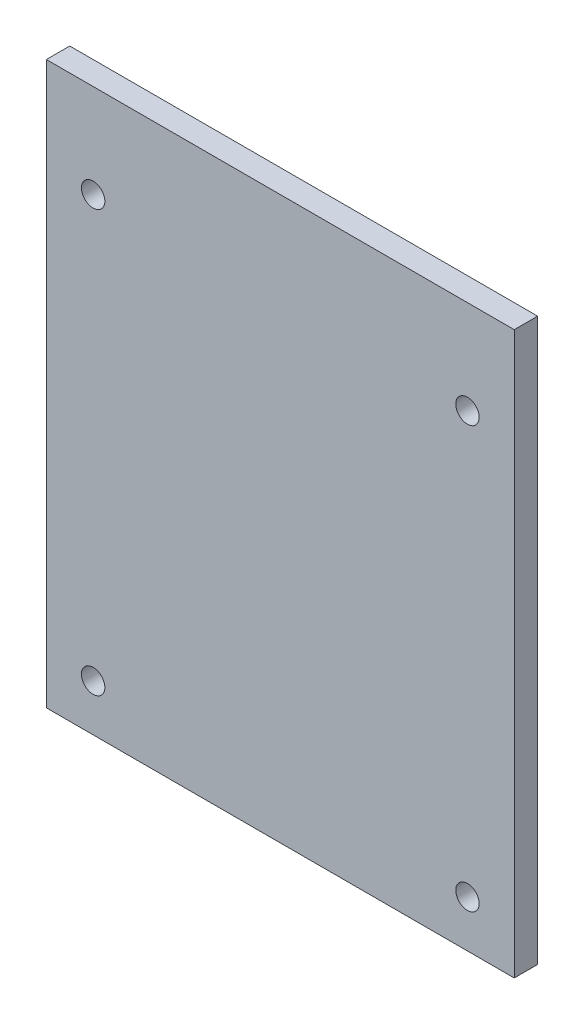
ISO-10303-21;
HEADER;
FILE_DESCRIPTION(('STEP AP214'),'2;1');
FILE_NAME('part.step','',(''),(''),'','','');
FILE_SCHEMA(('AUTOMOTIVE_DESIGN { 1 0 10303 214 1 1 1 1 }'));
ENDSEC;
DATA;
#1=APPLICATION_CONTEXT('core data for automotive mechanical design processes');
#2=APPLICATION_PROTOCOL_DEFINITION('international standard','automotive_design',2000,#1);
#3=PRODUCT_CONTEXT('',#1,'mechanical');
#4=PRODUCT('Part','Part','',(#3));
#5=PRODUCT_RELATED_PRODUCT_CATEGORY('part','',(#4));
#6=PRODUCT_DEFINITION_FORMATION('','',#4);
#7=PRODUCT_DEFINITION_CONTEXT('part definition',#1,'design');
#8=PRODUCT_DEFINITION('design','',#6,#7);
#9=PRODUCT_DEFINITION_SHAPE('','',#8);
#10=(LENGTH_UNIT() NAMED_UNIT(*) SI_UNIT(.MILLI.,.METRE.));
#11=(NAMED_UNIT(*) PLANE_ANGLE_UNIT() SI_UNIT($,.RADIAN.));
#12=(NAMED_UNIT(*) SI_UNIT($,.STERADIAN.) SOLID_ANGLE_UNIT());
#13=UNCERTAINTY_MEASURE_WITH_UNIT(LENGTH_MEASURE(1.E-05),#10,'distance_accuracy_value','');
#14=(GEOMETRIC_REPRESENTATION_CONTEXT(3) GLOBAL_UNCERTAINTY_ASSIGNED_CONTEXT((#13)) GLOBAL_UNIT_ASSIGNED_CONTEXT((#10,
#11,#12)) REPRESENTATION_CONTEXT('',''));
#15=CARTESIAN_POINT('',(0.,0.,0.));
#16=DIRECTION('',(0.,0.,1.));
#17=DIRECTION('',(1.,0.,0.));
#18=AXIS2_PLACEMENT_3D('',#15,#16,#17);
#19=CARTESIAN_POINT('',(-25.,25.,0.));
#20=DIRECTION('',(0.,0.,1.));
#21=DIRECTION('',(1.,0.,0.));
#22=AXIS2_PLACEMENT_3D('',#19,#20,#21);
#23=PLANE('',#22);
#24=DIRECTION('',(0.,1.,0.));
#25=VECTOR('',#24,1.);
#26=CARTESIAN_POINT('',(-50.,-75.,0.));
#27=LINE('',#26,#25);
#28=CARTESIAN_POINT('',(-50.,-25.0000000000007,0.));
#29=VERTEX_POINT('',#28);
#30=CARTESIAN_POINT('',(-50.,95.,0.));
#31=VERTEX_POINT('',#30);
#32=EDGE_CURVE('E91',#29,#31,#27,.T.);
#33=ORIENTED_EDGE('',*,*,#32,.F.);
#34=DIRECTION('',(1.,0.,0.));
#35=VECTOR('',#34,1.);
#36=CARTESIAN_POINT('',(0.,-25.0000000000007,0.));
#37=LINE('',#36,#35);
#38=CARTESIAN_POINT('',(50.,-25.0000000000007,0.));
#39=VERTEX_POINT('',#38);
#40=EDGE_CURVE('E76',#29,#39,#37,.T.);
#41=ORIENTED_EDGE('',*,*,#40,.T.);
#42=DIRECTION('',(0.,-1.,0.));
#43=VECTOR('',#42,1.);
#44=CARTESIAN_POINT('',(50.,-75.,0.));
#45=LINE('',#44,#43);
#46=CARTESIAN_POINT('',(50.,95.,0.));
#47=VERTEX_POINT('',#46);
#48=EDGE_CURVE('E38',#47,#39,#45,.T.);
#49=ORIENTED_EDGE('',*,*,#48,.F.);
#50=DIRECTION('',(1.,0.,0.));
#51=VECTOR('',#50,1.);
#52=CARTESIAN_POINT('',(-50.,95.,0.));
#53=LINE('',#52,#51);
#54=EDGE_CURVE('E56',#31,#47,#53,.T.);
#55=ORIENTED_EDGE('',*,*,#54,.F.);
#56=EDGE_LOOP('',(#33,#41,#49,#55));
#57=FACE_BOUND('',#56,.T.);
#58=CARTESIAN_POINT('',(-40.,75.,0.));
#59=DIRECTION('',(0.,0.,1.));
#60=DIRECTION('',(1.,0.,0.));
#61=AXIS2_PLACEMENT_3D('',#58,#59,#60);
#62=CIRCLE('',#61,2.49999999999986);
#63=CARTESIAN_POINT('',(-37.5000000000001,75.,0.));
#64=VERTEX_POINT('',#63);
#65=EDGE_CURVE('E107',#64,#64,#62,.T.);
#66=ORIENTED_EDGE('',*,*,#65,.F.);
#67=EDGE_LOOP('',(#66));
#68=FACE_BOUND('',#67,.T.);
#69=CARTESIAN_POINT('',(-40.,-15.,0.));
#70=DIRECTION('',(0.,0.,1.));
#71=DIRECTION('',(1.,0.,0.));
#72=AXIS2_PLACEMENT_3D('',#69,#70,#71);
#73=CIRCLE('',#72,2.49999999999986);
#74=CARTESIAN_POINT('',(-37.5000000000001,-15.,0.));
#75=VERTEX_POINT('',#74);
#76=EDGE_CURVE('E102',#75,#75,#73,.T.);
#77=ORIENTED_EDGE('',*,*,#76,.F.);
#78=EDGE_LOOP('',(#77));
#79=FACE_BOUND('',#78,.T.);
#80=CARTESIAN_POINT('',(40.,75.,0.));
#81=DIRECTION('',(0.,0.,1.));
#82=DIRECTION('',(1.,0.,0.));
#83=AXIS2_PLACEMENT_3D('',#80,#81,#82);
#84=CIRCLE('',#83,2.49999999999986);
#85=CARTESIAN_POINT('',(42.4999999999999,75.,0.));
#86=VERTEX_POINT('',#85);
#87=EDGE_CURVE('E119',#86,#86,#84,.T.);
#88=ORIENTED_EDGE('',*,*,#87,.F.);
#89=EDGE_LOOP('',(#88));
#90=FACE_BOUND('',#89,.T.);
#91=CARTESIAN_POINT('',(40.,-15.,0.));
#92=DIRECTION('',(0.,0.,1.));
#93=DIRECTION('',(1.,0.,0.));
#94=AXIS2_PLACEMENT_3D('',#91,#92,#93);
#95=CIRCLE('',#94,2.49999999999986);
#96=CARTESIAN_POINT('',(42.4999999999999,-15.,0.));
#97=VERTEX_POINT('',#96);
#98=EDGE_CURVE('E113',#97,#97,#95,.T.);
#99=ORIENTED_EDGE('',*,*,#98,.F.);
#100=EDGE_LOOP('',(#99));
#101=FACE_BOUND('',#100,.T.);
#102=ADVANCED_FACE('F34',(#57,#68,#79,#90,#101),#23,.T.);
#103=CARTESIAN_POINT('',(-25.,-25.,2100.));
#104=DIRECTION('',(0.,1.,0.));
#105=DIRECTION('',(0.,0.,1.));
#106=AXIS2_PLACEMENT_3D('',#103,#104,#105);
#107=PLANE('',#106);
#108=ORIENTED_EDGE('',*,*,#40,.F.);
#109=DIRECTION('',(0.,0.,-1.));
#110=VECTOR('',#109,1.);
#111=CARTESIAN_POINT('',(-50.,-25.0000000000007,-5.));
#112=LINE('',#111,#110);
#113=CARTESIAN_POINT('',(-50.,-25.0000000000007,-5.));
#114=VERTEX_POINT('',#113);
#115=EDGE_CURVE('E78',#29,#114,#112,.T.);
#116=ORIENTED_EDGE('',*,*,#115,.T.);
#117=DIRECTION('',(1.,0.,0.));
#118=VECTOR('',#117,1.);
#119=CARTESIAN_POINT('',(-5200.,-25.0000000000007,-4.99999999999989));
#120=LINE('',#119,#118);
#121=CARTESIAN_POINT('',(49.9999999999998,-25.0000000000007,-4.99999999999989));
#122=VERTEX_POINT('',#121);
#123=EDGE_CURVE('E94',#114,#122,#120,.T.);
#124=ORIENTED_EDGE('',*,*,#123,.T.);
#125=DIRECTION('',(0.,0.,1.));
#126=VECTOR('',#125,1.);
#127=CARTESIAN_POINT('',(50.,-25.0000000000007,-5.));
#128=LINE('',#127,#126);
#129=EDGE_CURVE('E81',#122,#39,#128,.T.);
#130=ORIENTED_EDGE('',*,*,#129,.T.);
#131=EDGE_LOOP('',(#108,#116,#124,#130));
#132=FACE_BOUND('',#131,.T.);
#133=ADVANCED_FACE('F36',(#132),#107,.F.);
#134=CARTESIAN_POINT('',(-40.,-15.,-5.));
#135=DIRECTION('',(0.,0.,-1.));
#136=DIRECTION('',(-1.,0.,0.));
#137=AXIS2_PLACEMENT_3D('',#134,#135,#136);
#138=CYLINDRICAL_SURFACE('',#137,2.49999999999986);
#139=ORIENTED_EDGE('',*,*,#76,.T.);
#140=EDGE_LOOP('',(#139));
#141=FACE_BOUND('',#140,.T.);
#142=CARTESIAN_POINT('',(-40.,-15.,-5.));
#143=DIRECTION('',(0.,0.,-1.));
#144=DIRECTION('',(-1.,0.,0.));
#145=AXIS2_PLACEMENT_3D('',#142,#143,#144);
#146=CIRCLE('',#145,2.49999999999999);
#147=CARTESIAN_POINT('',(-42.5,-15.,-5.));
#148=VERTEX_POINT('',#147);
#149=EDGE_CURVE('E106',#148,#148,#146,.T.);
#150=ORIENTED_EDGE('',*,*,#149,.T.);
#151=EDGE_LOOP('',(#150));
#152=FACE_BOUND('',#151,.T.);
#153=ADVANCED_FACE('F145',(#141,#152),#138,.F.);
#154=CARTESIAN_POINT('',(-40.,75.,-5.));
#155=DIRECTION('',(0.,0.,-1.));
#156=DIRECTION('',(-1.,0.,0.));
#157=AXIS2_PLACEMENT_3D('',#154,#155,#156);
#158=CYLINDRICAL_SURFACE('',#157,2.49999999999986);
#159=ORIENTED_EDGE('',*,*,#65,.T.);
#160=EDGE_LOOP('',(#159));
#161=FACE_BOUND('',#160,.T.);
#162=CARTESIAN_POINT('',(-40.,75.,-5.));
#163=DIRECTION('',(0.,0.,-1.));
#164=DIRECTION('',(-1.,0.,0.));
#165=AXIS2_PLACEMENT_3D('',#162,#163,#164);
#166=CIRCLE('',#165,2.49999999999999);
#167=CARTESIAN_POINT('',(-42.5,75.,-5.));
#168=VERTEX_POINT('',#167);
#169=EDGE_CURVE('E93',#168,#168,#166,.T.);
#170=ORIENTED_EDGE('',*,*,#169,.T.);
#171=EDGE_LOOP('',(#170));
#172=FACE_BOUND('',#171,.T.);
#173=ADVANCED_FACE('F154',(#161,#172),#158,.F.);
#174=CARTESIAN_POINT('',(-50.,-75.,-5.));
#175=DIRECTION('',(1.,0.,0.));
#176=DIRECTION('',(0.,0.,-1.));
#177=AXIS2_PLACEMENT_3D('',#174,#175,#176);
#178=PLANE('',#177);
#179=ORIENTED_EDGE('',*,*,#115,.F.);
#180=ORIENTED_EDGE('',*,*,#32,.T.);
#181=DIRECTION('',(0.,0.,1.));
#182=VECTOR('',#181,1.);
#183=CARTESIAN_POINT('',(-50.,95.,-5.));
#184=LINE('',#183,#182);
#185=CARTESIAN_POINT('',(-50.,95.,-5.));
#186=VERTEX_POINT('',#185);
#187=EDGE_CURVE('E105',#186,#31,#184,.T.);
#188=ORIENTED_EDGE('',*,*,#187,.F.);
#189=DIRECTION('',(0.,1.,0.));
#190=VECTOR('',#189,1.);
#191=CARTESIAN_POINT('',(-50.,-75.,-5.));
#192=LINE('',#191,#190);
#193=EDGE_CURVE('E92',#114,#186,#192,.T.);
#194=ORIENTED_EDGE('',*,*,#193,.F.);
#195=EDGE_LOOP('',(#179,#180,#188,#194));
#196=FACE_BOUND('',#195,.T.);
#197=ADVANCED_FACE('F89',(#196),#178,.F.);
#198=CARTESIAN_POINT('',(0.,0.,-5.));
#199=DIRECTION('',(0.,0.,1.));
#200=DIRECTION('',(1.,0.,0.));
#201=AXIS2_PLACEMENT_3D('',#198,#199,#200);
#202=PLANE('',#201);
#203=ORIENTED_EDGE('',*,*,#149,.F.);
#204=EDGE_LOOP('',(#203));
#205=FACE_BOUND('',#204,.T.);
#206=ORIENTED_EDGE('',*,*,#169,.F.);
#207=EDGE_LOOP('',(#206));
#208=FACE_BOUND('',#207,.T.);
#209=DIRECTION('',(-1.,0.,0.));
#210=VECTOR('',#209,1.);
#211=CARTESIAN_POINT('',(50.,95.,-5.));
#212=LINE('',#211,#210);
#213=CARTESIAN_POINT('',(50.,95.,-5.));
#214=VERTEX_POINT('',#213);
#215=EDGE_CURVE('E48',#214,#186,#212,.T.);
#216=ORIENTED_EDGE('',*,*,#215,.F.);
#217=DIRECTION('',(0.,-1.,0.));
#218=VECTOR('',#217,1.);
#219=CARTESIAN_POINT('',(50.,-75.,-5.));
#220=LINE('',#219,#218);
#221=EDGE_CURVE('E11',#214,#122,#220,.T.);
#222=ORIENTED_EDGE('',*,*,#221,.T.);
#223=ORIENTED_EDGE('',*,*,#123,.F.);
#224=ORIENTED_EDGE('',*,*,#193,.T.);
#225=EDGE_LOOP('',(#216,#222,#223,#224));
#226=FACE_BOUND('',#225,.T.);
#227=CARTESIAN_POINT('',(40.,-15.,-5.));
#228=DIRECTION('',(0.,0.,-1.));
#229=DIRECTION('',(-1.,0.,0.));
#230=AXIS2_PLACEMENT_3D('',#227,#228,#229);
#231=CIRCLE('',#230,2.49999999999999);
#232=CARTESIAN_POINT('',(37.5,-15.,-5.));
#233=VERTEX_POINT('',#232);
#234=EDGE_CURVE('E85',#233,#233,#231,.T.);
#235=ORIENTED_EDGE('',*,*,#234,.F.);
#236=EDGE_LOOP('',(#235));
#237=FACE_BOUND('',#236,.T.);
#238=CARTESIAN_POINT('',(40.,75.,-5.));
#239=DIRECTION('',(0.,0.,-1.));
#240=DIRECTION('',(-1.,0.,0.));
#241=AXIS2_PLACEMENT_3D('',#238,#239,#240);
#242=CIRCLE('',#241,2.49999999999999);
#243=CARTESIAN_POINT('',(37.5,75.,-5.));
#244=VERTEX_POINT('',#243);
#245=EDGE_CURVE('E116',#244,#244,#242,.T.);
#246=ORIENTED_EDGE('',*,*,#245,.F.);
#247=EDGE_LOOP('',(#246));
#248=FACE_BOUND('',#247,.T.);
#249=ADVANCED_FACE('F126',(#205,#208,#226,#237,#248),#202,.F.);
#250=CARTESIAN_POINT('',(0.,95.,0.));
#251=DIRECTION('',(0.,1.,0.));
#252=DIRECTION('',(0.,0.,1.));
#253=AXIS2_PLACEMENT_3D('',#250,#251,#252);
#254=PLANE('',#253);
#255=ORIENTED_EDGE('',*,*,#54,.T.);
#256=DIRECTION('',(0.,0.,-1.));
#257=VECTOR('',#256,1.);
#258=CARTESIAN_POINT('',(50.,95.,0.));
#259=LINE('',#258,#257);
#260=EDGE_CURVE('E122',#47,#214,#259,.T.);
#261=ORIENTED_EDGE('',*,*,#260,.T.);
#262=ORIENTED_EDGE('',*,*,#215,.T.);
#263=ORIENTED_EDGE('',*,*,#187,.T.);
#264=EDGE_LOOP('',(#255,#261,#262,#263));
#265=FACE_BOUND('',#264,.T.);
#266=ADVANCED_FACE('F134',(#265),#254,.T.);
#267=CARTESIAN_POINT('',(40.,75.,-5.));
#268=DIRECTION('',(0.,0.,-1.));
#269=DIRECTION('',(-1.,0.,0.));
#270=AXIS2_PLACEMENT_3D('',#267,#268,#269);
#271=CYLINDRICAL_SURFACE('',#270,2.49999999999986);
#272=ORIENTED_EDGE('',*,*,#87,.T.);
#273=EDGE_LOOP('',(#272));
#274=FACE_BOUND('',#273,.T.);
#275=ORIENTED_EDGE('',*,*,#245,.T.);
#276=EDGE_LOOP('',(#275));
#277=FACE_BOUND('',#276,.T.);
#278=ADVANCED_FACE('F136',(#274,#277),#271,.F.);
#279=CARTESIAN_POINT('',(40.,-15.,-5.));
#280=DIRECTION('',(0.,0.,-1.));
#281=DIRECTION('',(-1.,0.,0.));
#282=AXIS2_PLACEMENT_3D('',#279,#280,#281);
#283=CYLINDRICAL_SURFACE('',#282,2.49999999999986);
#284=ORIENTED_EDGE('',*,*,#98,.T.);
#285=EDGE_LOOP('',(#284));
#286=FACE_BOUND('',#285,.T.);
#287=ORIENTED_EDGE('',*,*,#234,.T.);
#288=EDGE_LOOP('',(#287));
#289=FACE_BOUND('',#288,.T.);
#290=ADVANCED_FACE('F142',(#286,#289),#283,.F.);
#291=CARTESIAN_POINT('',(50.,-75.,-5.));
#292=DIRECTION('',(-1.,0.,0.));
#293=DIRECTION('',(0.,0.,1.));
#294=AXIS2_PLACEMENT_3D('',#291,#292,#293);
#295=PLANE('',#294);
#296=ORIENTED_EDGE('',*,*,#129,.F.);
#297=ORIENTED_EDGE('',*,*,#221,.F.);
#298=ORIENTED_EDGE('',*,*,#260,.F.);
#299=ORIENTED_EDGE('',*,*,#48,.T.);
#300=EDGE_LOOP('',(#296,#297,#298,#299));
#301=FACE_BOUND('',#300,.T.);
#302=ADVANCED_FACE('F125',(#301),#295,.F.);
#303=CLOSED_SHELL('',(#102,#133,#153,#173,#197,#249,#266,#278,#290,#302));
#304=MANIFOLD_SOLID_BREP('B2',#303);
#305=ADVANCED_BREP_SHAPE_REPRESENTATION('',(#18,#304),#14);
#306=SHAPE_DEFINITION_REPRESENTATION(#9,#305);
ENDSEC;
END-ISO-10303-21;
